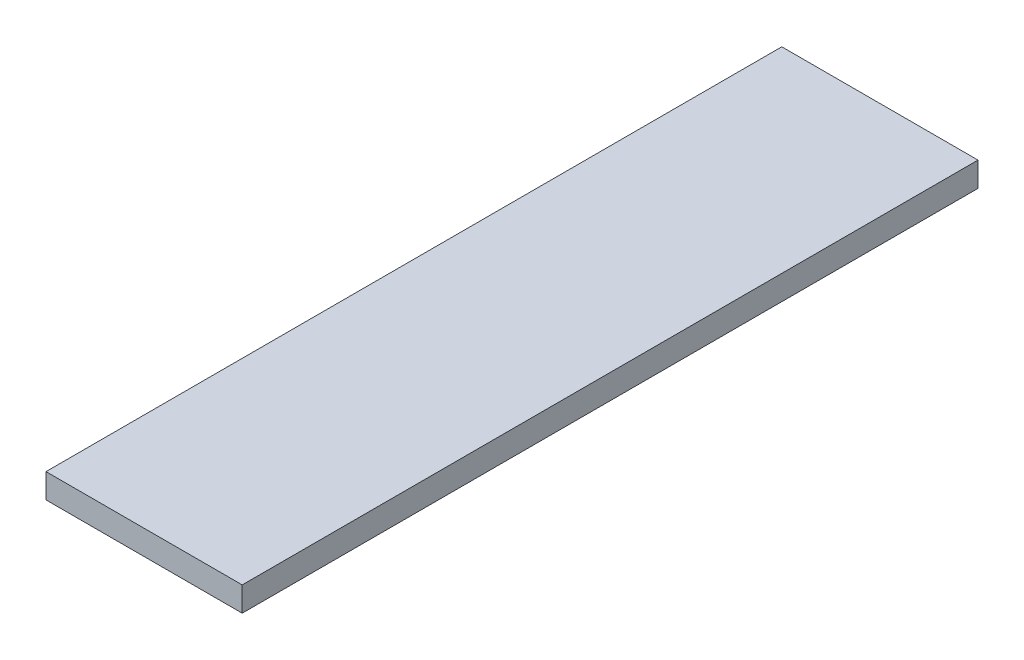
ISO-10303-21;
HEADER;
FILE_DESCRIPTION(('STEP AP214'),'2;1');
FILE_NAME('part.step','',(''),(''),'','','');
FILE_SCHEMA(('AUTOMOTIVE_DESIGN { 1 0 10303 214 1 1 1 1 }'));
ENDSEC;
DATA;
#1=APPLICATION_CONTEXT('core data for automotive mechanical design processes');
#2=APPLICATION_PROTOCOL_DEFINITION('international standard','automotive_design',2000,#1);
#3=PRODUCT_CONTEXT('',#1,'mechanical');
#4=PRODUCT('Part','Part','',(#3));
#5=PRODUCT_RELATED_PRODUCT_CATEGORY('part','',(#4));
#6=PRODUCT_DEFINITION_FORMATION('','',#4);
#7=PRODUCT_DEFINITION_CONTEXT('part definition',#1,'design');
#8=PRODUCT_DEFINITION('design','',#6,#7);
#9=PRODUCT_DEFINITION_SHAPE('','',#8);
#10=(LENGTH_UNIT() NAMED_UNIT(*) SI_UNIT(.MILLI.,.METRE.));
#11=(NAMED_UNIT(*) PLANE_ANGLE_UNIT() SI_UNIT($,.RADIAN.));
#12=(NAMED_UNIT(*) SI_UNIT($,.STERADIAN.) SOLID_ANGLE_UNIT());
#13=UNCERTAINTY_MEASURE_WITH_UNIT(LENGTH_MEASURE(1.E-05),#10,'distance_accuracy_value','');
#14=(GEOMETRIC_REPRESENTATION_CONTEXT(3) GLOBAL_UNCERTAINTY_ASSIGNED_CONTEXT((#13)) GLOBAL_UNIT_ASSIGNED_CONTEXT((#10,
#11,#12)) REPRESENTATION_CONTEXT('',''));
#15=CARTESIAN_POINT('',(0.,0.,0.));
#16=DIRECTION('',(0.,0.,1.));
#17=DIRECTION('',(1.,0.,0.));
#18=AXIS2_PLACEMENT_3D('',#15,#16,#17);
#19=CARTESIAN_POINT('',(0.,0.,190.5));
#20=DIRECTION('',(-1.,0.,0.));
#21=DIRECTION('',(0.,0.,1.));
#22=AXIS2_PLACEMENT_3D('',#19,#20,#21);
#23=PLANE('',#22);
#24=DIRECTION('',(0.,1.,0.));
#25=VECTOR('',#24,1.);
#26=CARTESIAN_POINT('',(0.,0.,0.));
#27=LINE('',#26,#25);
#28=CARTESIAN_POINT('',(0.,0.,0.));
#29=VERTEX_POINT('',#28);
#30=CARTESIAN_POINT('',(0.,6.35,0.));
#31=VERTEX_POINT('',#30);
#32=EDGE_CURVE('E90',#29,#31,#27,.T.);
#33=ORIENTED_EDGE('',*,*,#32,.F.);
#34=DIRECTION('',(0.,0.,-1.));
#35=VECTOR('',#34,1.);
#36=CARTESIAN_POINT('',(0.,0.,190.5));
#37=LINE('',#36,#35);
#38=CARTESIAN_POINT('',(0.,0.,190.5));
#39=VERTEX_POINT('',#38);
#40=EDGE_CURVE('E11',#39,#29,#37,.T.);
#41=ORIENTED_EDGE('',*,*,#40,.F.);
#42=DIRECTION('',(0.,1.,0.));
#43=VECTOR('',#42,1.);
#44=CARTESIAN_POINT('',(0.,0.,190.5));
#45=LINE('',#44,#43);
#46=CARTESIAN_POINT('',(0.,6.35,190.5));
#47=VERTEX_POINT('',#46);
#48=EDGE_CURVE('E81',#39,#47,#45,.T.);
#49=ORIENTED_EDGE('',*,*,#48,.T.);
#50=DIRECTION('',(0.,0.,-1.));
#51=VECTOR('',#50,1.);
#52=CARTESIAN_POINT('',(0.,6.35,190.5));
#53=LINE('',#52,#51);
#54=EDGE_CURVE('E36',#47,#31,#53,.T.);
#55=ORIENTED_EDGE('',*,*,#54,.T.);
#56=EDGE_LOOP('',(#33,#41,#49,#55));
#57=FACE_BOUND('',#56,.T.);
#58=ADVANCED_FACE('F33',(#57),#23,.T.);
#59=CARTESIAN_POINT('',(0.,0.,190.5));
#60=DIRECTION('',(0.,1.,0.));
#61=DIRECTION('',(0.,0.,1.));
#62=AXIS2_PLACEMENT_3D('',#59,#60,#61);
#63=PLANE('',#62);
#64=DIRECTION('',(1.,0.,0.));
#65=VECTOR('',#64,1.);
#66=CARTESIAN_POINT('',(0.,0.,0.));
#67=LINE('',#66,#65);
#68=CARTESIAN_POINT('',(50.8,0.,0.));
#69=VERTEX_POINT('',#68);
#70=EDGE_CURVE('E73',#29,#69,#67,.T.);
#71=ORIENTED_EDGE('',*,*,#70,.T.);
#72=DIRECTION('',(0.,0.,-1.));
#73=VECTOR('',#72,1.);
#74=CARTESIAN_POINT('',(50.8,0.,190.5));
#75=LINE('',#74,#73);
#76=CARTESIAN_POINT('',(50.8,0.,190.5));
#77=VERTEX_POINT('',#76);
#78=EDGE_CURVE('E76',#77,#69,#75,.T.);
#79=ORIENTED_EDGE('',*,*,#78,.F.);
#80=DIRECTION('',(1.,0.,0.));
#81=VECTOR('',#80,1.);
#82=CARTESIAN_POINT('',(0.,0.,190.5));
#83=LINE('',#82,#81);
#84=EDGE_CURVE('E62',#39,#77,#83,.T.);
#85=ORIENTED_EDGE('',*,*,#84,.F.);
#86=ORIENTED_EDGE('',*,*,#40,.T.);
#87=EDGE_LOOP('',(#71,#79,#85,#86));
#88=FACE_BOUND('',#87,.T.);
#89=ADVANCED_FACE('F75',(#88),#63,.F.);
#90=CARTESIAN_POINT('',(0.,6.35,190.5));
#91=DIRECTION('',(0.,1.,0.));
#92=DIRECTION('',(0.,0.,1.));
#93=AXIS2_PLACEMENT_3D('',#90,#91,#92);
#94=PLANE('',#93);
#95=DIRECTION('',(1.,0.,0.));
#96=VECTOR('',#95,1.);
#97=CARTESIAN_POINT('',(0.,6.35,0.));
#98=LINE('',#97,#96);
#99=CARTESIAN_POINT('',(50.8,6.35,0.));
#100=VERTEX_POINT('',#99);
#101=EDGE_CURVE('E82',#31,#100,#98,.T.);
#102=ORIENTED_EDGE('',*,*,#101,.F.);
#103=ORIENTED_EDGE('',*,*,#54,.F.);
#104=DIRECTION('',(1.,0.,0.));
#105=VECTOR('',#104,1.);
#106=CARTESIAN_POINT('',(0.,6.35,190.5));
#107=LINE('',#106,#105);
#108=CARTESIAN_POINT('',(50.8,6.35,190.5));
#109=VERTEX_POINT('',#108);
#110=EDGE_CURVE('E100',#47,#109,#107,.T.);
#111=ORIENTED_EDGE('',*,*,#110,.T.);
#112=DIRECTION('',(0.,0.,-1.));
#113=VECTOR('',#112,1.);
#114=CARTESIAN_POINT('',(50.8,6.35,190.5));
#115=LINE('',#114,#113);
#116=EDGE_CURVE('E91',#109,#100,#115,.T.);
#117=ORIENTED_EDGE('',*,*,#116,.T.);
#118=EDGE_LOOP('',(#102,#103,#111,#117));
#119=FACE_BOUND('',#118,.T.);
#120=ADVANCED_FACE('F108',(#119),#94,.T.);
#121=CARTESIAN_POINT('',(0.,0.,190.5));
#122=DIRECTION('',(0.,0.,-1.));
#123=DIRECTION('',(-1.,0.,0.));
#124=AXIS2_PLACEMENT_3D('',#121,#122,#123);
#125=PLANE('',#124);
#126=ORIENTED_EDGE('',*,*,#48,.F.);
#127=ORIENTED_EDGE('',*,*,#84,.T.);
#128=DIRECTION('',(0.,1.,0.));
#129=VECTOR('',#128,1.);
#130=CARTESIAN_POINT('',(50.8,0.,190.5));
#131=LINE('',#130,#129);
#132=EDGE_CURVE('E89',#77,#109,#131,.T.);
#133=ORIENTED_EDGE('',*,*,#132,.T.);
#134=ORIENTED_EDGE('',*,*,#110,.F.);
#135=EDGE_LOOP('',(#126,#127,#133,#134));
#136=FACE_BOUND('',#135,.T.);
#137=ADVANCED_FACE('F113',(#136),#125,.F.);
#138=CARTESIAN_POINT('',(0.,0.,0.));
#139=DIRECTION('',(0.,0.,-1.));
#140=DIRECTION('',(-1.,0.,0.));
#141=AXIS2_PLACEMENT_3D('',#138,#139,#140);
#142=PLANE('',#141);
#143=ORIENTED_EDGE('',*,*,#32,.T.);
#144=ORIENTED_EDGE('',*,*,#101,.T.);
#145=DIRECTION('',(0.,1.,0.));
#146=VECTOR('',#145,1.);
#147=CARTESIAN_POINT('',(50.8,0.,0.));
#148=LINE('',#147,#146);
#149=EDGE_CURVE('E88',#69,#100,#148,.T.);
#150=ORIENTED_EDGE('',*,*,#149,.F.);
#151=ORIENTED_EDGE('',*,*,#70,.F.);
#152=EDGE_LOOP('',(#143,#144,#150,#151));
#153=FACE_BOUND('',#152,.T.);
#154=ADVANCED_FACE('F93',(#153),#142,.T.);
#155=CARTESIAN_POINT('',(50.8,0.,190.5));
#156=DIRECTION('',(1.,0.,0.));
#157=DIRECTION('',(0.,0.,1.));
#158=AXIS2_PLACEMENT_3D('',#155,#156,#157);
#159=PLANE('',#158);
#160=ORIENTED_EDGE('',*,*,#149,.T.);
#161=ORIENTED_EDGE('',*,*,#116,.F.);
#162=ORIENTED_EDGE('',*,*,#132,.F.);
#163=ORIENTED_EDGE('',*,*,#78,.T.);
#164=EDGE_LOOP('',(#160,#161,#162,#163));
#165=FACE_BOUND('',#164,.T.);
#166=ADVANCED_FACE('F86',(#165),#159,.T.);
#167=CLOSED_SHELL('',(#58,#89,#120,#137,#154,#166));
#168=MANIFOLD_SOLID_BREP('B2',#167);
#169=ADVANCED_BREP_SHAPE_REPRESENTATION('',(#18,#168),#14);
#170=SHAPE_DEFINITION_REPRESENTATION(#9,#169);
ENDSEC;
END-ISO-10303-21;
